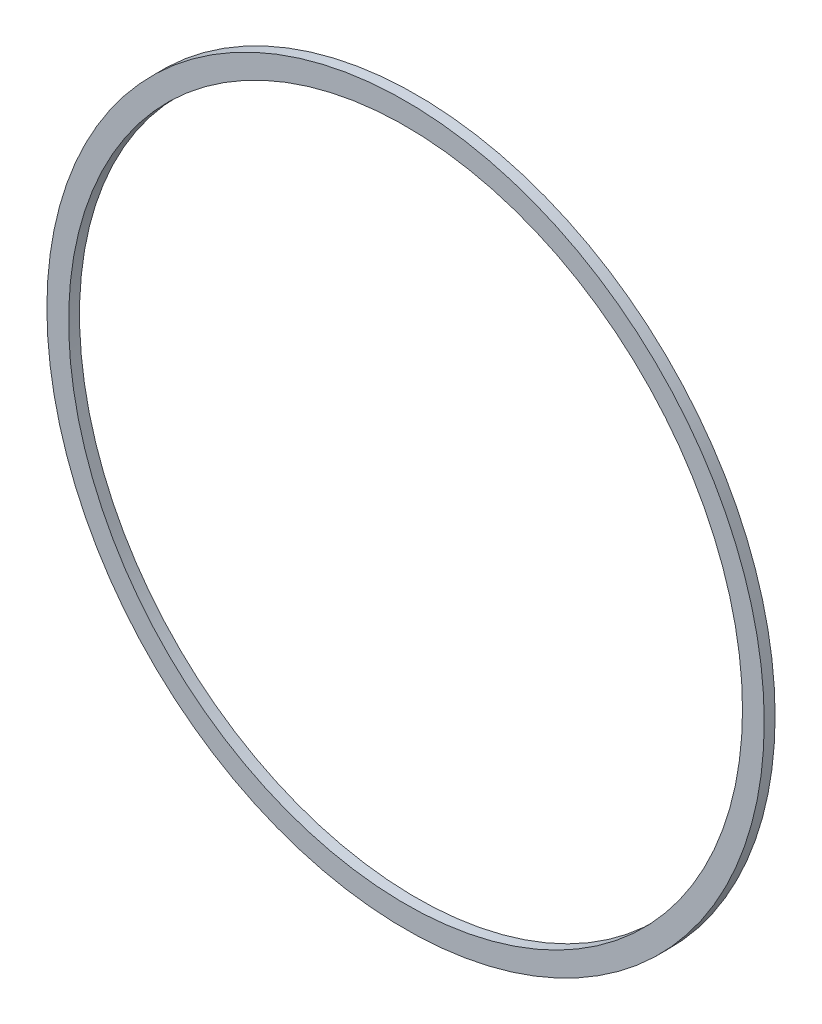
ISO-10303-21;
HEADER;
FILE_DESCRIPTION(('STEP AP214'),'2;1');
FILE_NAME('part.step','',(''),(''),'','','');
FILE_SCHEMA(('AUTOMOTIVE_DESIGN { 1 0 10303 214 1 1 1 1 }'));
ENDSEC;
DATA;
#1=APPLICATION_CONTEXT('core data for automotive mechanical design processes');
#2=APPLICATION_PROTOCOL_DEFINITION('international standard','automotive_design',2000,#1);
#3=PRODUCT_CONTEXT('',#1,'mechanical');
#4=PRODUCT('Part','Part','',(#3));
#5=PRODUCT_RELATED_PRODUCT_CATEGORY('part','',(#4));
#6=PRODUCT_DEFINITION_FORMATION('','',#4);
#7=PRODUCT_DEFINITION_CONTEXT('part definition',#1,'design');
#8=PRODUCT_DEFINITION('design','',#6,#7);
#9=PRODUCT_DEFINITION_SHAPE('','',#8);
#10=(LENGTH_UNIT() NAMED_UNIT(*) SI_UNIT(.MILLI.,.METRE.));
#11=(NAMED_UNIT(*) PLANE_ANGLE_UNIT() SI_UNIT($,.RADIAN.));
#12=(NAMED_UNIT(*) SI_UNIT($,.STERADIAN.) SOLID_ANGLE_UNIT());
#13=UNCERTAINTY_MEASURE_WITH_UNIT(LENGTH_MEASURE(1.E-05),#10,'distance_accuracy_value','');
#14=(GEOMETRIC_REPRESENTATION_CONTEXT(3) GLOBAL_UNCERTAINTY_ASSIGNED_CONTEXT((#13)) GLOBAL_UNIT_ASSIGNED_CONTEXT((#10,
#11,#12)) REPRESENTATION_CONTEXT('',''));
#15=CARTESIAN_POINT('',(0.,0.,0.));
#16=DIRECTION('',(0.,0.,1.));
#17=DIRECTION('',(1.,0.,0.));
#18=AXIS2_PLACEMENT_3D('',#15,#16,#17);
#19=CARTESIAN_POINT('',(0.,0.,0.));
#20=DIRECTION('',(0.,0.,1.));
#21=DIRECTION('',(1.,0.,0.));
#22=AXIS2_PLACEMENT_3D('',#19,#20,#21);
#23=PLANE('',#22);
#24=CARTESIAN_POINT('',(0.,0.,0.));
#25=DIRECTION('',(0.,0.,-1.));
#26=DIRECTION('',(-1.,0.,0.));
#27=AXIS2_PLACEMENT_3D('',#24,#25,#26);
#28=CIRCLE('',#27,62.);
#29=CARTESIAN_POINT('',(62.,0.,0.));
#30=VERTEX_POINT('',#29);
#31=EDGE_CURVE('E21',#30,#30,#28,.T.);
#32=ORIENTED_EDGE('',*,*,#31,.F.);
#33=EDGE_LOOP('',(#32));
#34=FACE_BOUND('',#33,.T.);
#35=CARTESIAN_POINT('',(0.,0.,0.));
#36=DIRECTION('',(0.,0.,1.));
#37=DIRECTION('',(1.,0.,0.));
#38=AXIS2_PLACEMENT_3D('',#35,#36,#37);
#39=CIRCLE('',#38,66.);
#40=CARTESIAN_POINT('',(-66.,0.,0.));
#41=VERTEX_POINT('',#40);
#42=EDGE_CURVE('E11',#41,#41,#39,.T.);
#43=ORIENTED_EDGE('',*,*,#42,.F.);
#44=EDGE_LOOP('',(#43));
#45=FACE_BOUND('',#44,.T.);
#46=ADVANCED_FACE('F17',(#34,#45),#23,.F.);
#47=CARTESIAN_POINT('',(0.,0.,2.));
#48=DIRECTION('',(0.,0.,1.));
#49=DIRECTION('',(1.,0.,0.));
#50=AXIS2_PLACEMENT_3D('',#47,#48,#49);
#51=PLANE('',#50);
#52=CARTESIAN_POINT('',(0.,0.,2.));
#53=DIRECTION('',(0.,0.,-1.));
#54=DIRECTION('',(-1.,0.,0.));
#55=AXIS2_PLACEMENT_3D('',#52,#53,#54);
#56=CIRCLE('',#55,62.);
#57=CARTESIAN_POINT('',(62.,0.,2.));
#58=VERTEX_POINT('',#57);
#59=EDGE_CURVE('E65',#58,#58,#56,.T.);
#60=ORIENTED_EDGE('',*,*,#59,.T.);
#61=EDGE_LOOP('',(#60));
#62=FACE_BOUND('',#61,.T.);
#63=CARTESIAN_POINT('',(0.,0.,2.));
#64=DIRECTION('',(0.,0.,1.));
#65=DIRECTION('',(1.,0.,0.));
#66=AXIS2_PLACEMENT_3D('',#63,#64,#65);
#67=CIRCLE('',#66,66.);
#68=CARTESIAN_POINT('',(-66.,0.,2.));
#69=VERTEX_POINT('',#68);
#70=EDGE_CURVE('E57',#69,#69,#67,.T.);
#71=ORIENTED_EDGE('',*,*,#70,.T.);
#72=EDGE_LOOP('',(#71));
#73=FACE_BOUND('',#72,.T.);
#74=ADVANCED_FACE('F76',(#62,#73),#51,.T.);
#75=CARTESIAN_POINT('',(0.,0.,0.));
#76=DIRECTION('',(0.,0.,1.));
#77=DIRECTION('',(1.,0.,0.));
#78=AXIS2_PLACEMENT_3D('',#75,#76,#77);
#79=CYLINDRICAL_SURFACE('',#78,66.);
#80=ORIENTED_EDGE('',*,*,#70,.F.);
#81=DIRECTION('',(0.,0.,-1.));
#82=VECTOR('',#81,1.);
#83=CARTESIAN_POINT('',(-66.,0.,0.));
#84=LINE('',#83,#82);
#85=EDGE_CURVE('E28',#69,#41,#84,.T.);
#86=ORIENTED_EDGE('',*,*,#85,.T.);
#87=ORIENTED_EDGE('',*,*,#42,.T.);
#88=ORIENTED_EDGE('',*,*,#85,.F.);
#89=EDGE_LOOP('',(#80,#86,#87,#88));
#90=FACE_BOUND('',#89,.T.);
#91=ADVANCED_FACE('F19',(#90),#79,.T.);
#92=CARTESIAN_POINT('',(0.,0.,0.));
#93=DIRECTION('',(0.,0.,1.));
#94=DIRECTION('',(-1.,0.,0.));
#95=AXIS2_PLACEMENT_3D('',#92,#93,#94);
#96=CYLINDRICAL_SURFACE('',#95,62.);
#97=ORIENTED_EDGE('',*,*,#59,.F.);
#98=DIRECTION('',(0.,0.,-1.));
#99=VECTOR('',#98,1.);
#100=CARTESIAN_POINT('',(62.,0.,0.));
#101=LINE('',#100,#99);
#102=EDGE_CURVE('E53',#58,#30,#101,.T.);
#103=ORIENTED_EDGE('',*,*,#102,.T.);
#104=ORIENTED_EDGE('',*,*,#31,.T.);
#105=ORIENTED_EDGE('',*,*,#102,.F.);
#106=EDGE_LOOP('',(#97,#103,#104,#105));
#107=FACE_BOUND('',#106,.T.);
#108=ADVANCED_FACE('F52',(#107),#96,.F.);
#109=CLOSED_SHELL('',(#46,#74,#91,#108));
#110=MANIFOLD_SOLID_BREP('B1',#109);
#111=ADVANCED_BREP_SHAPE_REPRESENTATION('',(#18,#110),#14);
#112=SHAPE_DEFINITION_REPRESENTATION(#9,#111);
ENDSEC;
END-ISO-10303-21;
